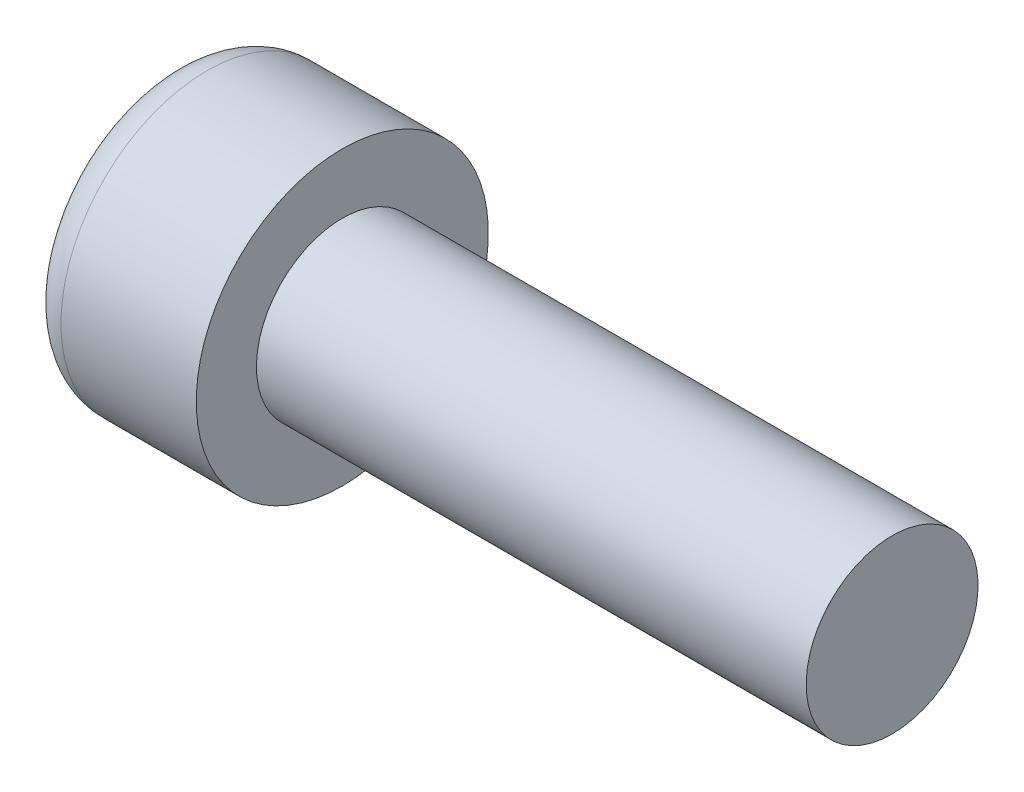
ISO-10303-21;
HEADER;
FILE_DESCRIPTION(('STEP AP214'),'2;1');
FILE_NAME('part.step','',(''),(''),'','','');
FILE_SCHEMA(('AUTOMOTIVE_DESIGN { 1 0 10303 214 1 1 1 1 }'));
ENDSEC;
DATA;
#1=APPLICATION_CONTEXT('core data for automotive mechanical design processes');
#2=APPLICATION_PROTOCOL_DEFINITION('international standard','automotive_design',2000,#1);
#3=PRODUCT_CONTEXT('',#1,'mechanical');
#4=PRODUCT('Part','Part','',(#3));
#5=PRODUCT_RELATED_PRODUCT_CATEGORY('part','',(#4));
#6=PRODUCT_DEFINITION_FORMATION('','',#4);
#7=PRODUCT_DEFINITION_CONTEXT('part definition',#1,'design');
#8=PRODUCT_DEFINITION('design','',#6,#7);
#9=PRODUCT_DEFINITION_SHAPE('','',#8);
#10=(LENGTH_UNIT() NAMED_UNIT(*) SI_UNIT(.MILLI.,.METRE.));
#11=(NAMED_UNIT(*) PLANE_ANGLE_UNIT() SI_UNIT($,.RADIAN.));
#12=(NAMED_UNIT(*) SI_UNIT($,.STERADIAN.) SOLID_ANGLE_UNIT());
#13=UNCERTAINTY_MEASURE_WITH_UNIT(LENGTH_MEASURE(1.E-05),#10,'distance_accuracy_value','');
#14=(GEOMETRIC_REPRESENTATION_CONTEXT(3) GLOBAL_UNCERTAINTY_ASSIGNED_CONTEXT((#13)) GLOBAL_UNIT_ASSIGNED_CONTEXT((#10,
#11,#12)) REPRESENTATION_CONTEXT('',''));
#15=CARTESIAN_POINT('',(0.,0.,0.));
#16=DIRECTION('',(0.,0.,1.));
#17=DIRECTION('',(1.,0.,0.));
#18=AXIS2_PLACEMENT_3D('',#15,#16,#17);
#19=CARTESIAN_POINT('',(0.,0.,0.));
#20=DIRECTION('',(1.,0.,0.));
#21=DIRECTION('',(0.,1.,0.));
#22=AXIS2_PLACEMENT_3D('',#19,#20,#21);
#23=PLANE('',#22);
#24=DIRECTION('',(0.,-0.5,-0.866025403784439));
#25=VECTOR('',#24,1.);
#26=CARTESIAN_POINT('',(0.,2.3094010767585,0.));
#27=LINE('',#26,#25);
#28=CARTESIAN_POINT('',(0.,2.3094010767585,0.));
#29=VERTEX_POINT('',#28);
#30=CARTESIAN_POINT('',(0.,1.15470053837925,-2.));
#31=VERTEX_POINT('',#30);
#32=EDGE_CURVE('E121',#29,#31,#27,.T.);
#33=ORIENTED_EDGE('',*,*,#32,.F.);
#34=DIRECTION('',(0.,0.5,-0.866025403784439));
#35=VECTOR('',#34,1.);
#36=CARTESIAN_POINT('',(0.,1.15470053837925,2.));
#37=LINE('',#36,#35);
#38=CARTESIAN_POINT('',(0.,1.15470053837925,2.));
#39=VERTEX_POINT('',#38);
#40=EDGE_CURVE('E47',#39,#29,#37,.T.);
#41=ORIENTED_EDGE('',*,*,#40,.F.);
#42=DIRECTION('',(0.,1.,0.));
#43=VECTOR('',#42,1.);
#44=CARTESIAN_POINT('',(0.,-1.15470053837925,2.));
#45=LINE('',#44,#43);
#46=CARTESIAN_POINT('',(0.,-1.15470053837925,2.));
#47=VERTEX_POINT('',#46);
#48=EDGE_CURVE('E130',#47,#39,#45,.T.);
#49=ORIENTED_EDGE('',*,*,#48,.F.);
#50=DIRECTION('',(0.,0.5,0.866025403784439));
#51=VECTOR('',#50,1.);
#52=CARTESIAN_POINT('',(0.,-2.3094010767585,0.));
#53=LINE('',#52,#51);
#54=CARTESIAN_POINT('',(0.,-2.3094010767585,0.));
#55=VERTEX_POINT('',#54);
#56=EDGE_CURVE('E128',#55,#47,#53,.T.);
#57=ORIENTED_EDGE('',*,*,#56,.F.);
#58=DIRECTION('',(0.,-0.5,0.866025403784439));
#59=VECTOR('',#58,1.);
#60=CARTESIAN_POINT('',(0.,-1.15470053837925,-2.));
#61=LINE('',#60,#59);
#62=CARTESIAN_POINT('',(0.,-1.15470053837925,-2.));
#63=VERTEX_POINT('',#62);
#64=EDGE_CURVE('E95',#63,#55,#61,.T.);
#65=ORIENTED_EDGE('',*,*,#64,.F.);
#66=DIRECTION('',(0.,-1.,0.));
#67=VECTOR('',#66,1.);
#68=CARTESIAN_POINT('',(0.,1.15470053837925,-2.));
#69=LINE('',#68,#67);
#70=EDGE_CURVE('E124',#31,#63,#69,.T.);
#71=ORIENTED_EDGE('',*,*,#70,.F.);
#72=EDGE_LOOP('',(#33,#41,#49,#57,#65,#71));
#73=FACE_BOUND('',#72,.T.);
#74=CARTESIAN_POINT('',(0.,0.,0.));
#75=DIRECTION('',(-1.,0.,0.));
#76=DIRECTION('',(0.,-1.,0.));
#77=AXIS2_PLACEMENT_3D('',#74,#75,#76);
#78=CIRCLE('',#77,3.1875);
#79=CARTESIAN_POINT('',(0.,-3.1875,0.));
#80=VERTEX_POINT('',#79);
#81=EDGE_CURVE('E11',#80,#80,#78,.T.);
#82=ORIENTED_EDGE('',*,*,#81,.T.);
#83=EDGE_LOOP('',(#82));
#84=FACE_BOUND('',#83,.T.);
#85=ADVANCED_FACE('F33',(#73,#84),#23,.F.);
#86=CARTESIAN_POINT('',(1.0625,0.,0.));
#87=DIRECTION('',(-1.,0.,0.));
#88=DIRECTION('',(0.,-1.,0.));
#89=AXIS2_PLACEMENT_3D('',#86,#87,#88);
#90=TOROIDAL_SURFACE('',#89,3.1875,1.0625);
#91=ORIENTED_EDGE('',*,*,#81,.F.);
#92=EDGE_LOOP('',(#91));
#93=FACE_BOUND('',#92,.T.);
#94=CARTESIAN_POINT('',(1.0625,0.,0.));
#95=DIRECTION('',(-1.,0.,0.));
#96=DIRECTION('',(0.,-1.,0.));
#97=AXIS2_PLACEMENT_3D('',#94,#95,#96);
#98=CIRCLE('',#97,4.25);
#99=CARTESIAN_POINT('',(1.0625,-4.25,0.));
#100=VERTEX_POINT('',#99);
#101=EDGE_CURVE('E40',#100,#100,#98,.T.);
#102=ORIENTED_EDGE('',*,*,#101,.T.);
#103=EDGE_LOOP('',(#102));
#104=FACE_BOUND('',#103,.T.);
#105=ADVANCED_FACE('F150',(#93,#104),#90,.T.);
#106=CARTESIAN_POINT('',(0.,0.,0.));
#107=DIRECTION('',(-1.,0.,0.));
#108=DIRECTION('',(0.,-1.,0.));
#109=AXIS2_PLACEMENT_3D('',#106,#107,#108);
#110=CYLINDRICAL_SURFACE('',#109,4.25);
#111=ORIENTED_EDGE('',*,*,#101,.F.);
#112=EDGE_LOOP('',(#111));
#113=FACE_BOUND('',#112,.T.);
#114=CARTESIAN_POINT('',(5.,0.,0.));
#115=DIRECTION('',(-1.,0.,0.));
#116=DIRECTION('',(0.,-1.,0.));
#117=AXIS2_PLACEMENT_3D('',#114,#115,#116);
#118=CIRCLE('',#117,4.25);
#119=CARTESIAN_POINT('',(5.,-4.25,0.));
#120=VERTEX_POINT('',#119);
#121=EDGE_CURVE('E145',#120,#120,#118,.T.);
#122=ORIENTED_EDGE('',*,*,#121,.T.);
#123=EDGE_LOOP('',(#122));
#124=FACE_BOUND('',#123,.T.);
#125=ADVANCED_FACE('F152',(#113,#124),#110,.T.);
#126=CARTESIAN_POINT('',(5.,4.25,0.));
#127=DIRECTION('',(-1.,0.,0.));
#128=DIRECTION('',(0.,-1.,0.));
#129=AXIS2_PLACEMENT_3D('',#126,#127,#128);
#130=PLANE('',#129);
#131=ORIENTED_EDGE('',*,*,#121,.F.);
#132=EDGE_LOOP('',(#131));
#133=FACE_BOUND('',#132,.T.);
#134=CARTESIAN_POINT('',(5.,0.,0.));
#135=DIRECTION('',(-1.,0.,0.));
#136=DIRECTION('',(0.,-1.,0.));
#137=AXIS2_PLACEMENT_3D('',#134,#135,#136);
#138=CIRCLE('',#137,2.5);
#139=CARTESIAN_POINT('',(5.,-2.5,0.));
#140=VERTEX_POINT('',#139);
#141=EDGE_CURVE('E142',#140,#140,#138,.T.);
#142=ORIENTED_EDGE('',*,*,#141,.T.);
#143=EDGE_LOOP('',(#142));
#144=FACE_BOUND('',#143,.T.);
#145=ADVANCED_FACE('F155',(#133,#144),#130,.F.);
#146=CARTESIAN_POINT('',(0.,0.,0.));
#147=DIRECTION('',(-1.,0.,0.));
#148=DIRECTION('',(0.,-1.,0.));
#149=AXIS2_PLACEMENT_3D('',#146,#147,#148);
#150=CYLINDRICAL_SURFACE('',#149,2.5);
#151=ORIENTED_EDGE('',*,*,#141,.F.);
#152=EDGE_LOOP('',(#151));
#153=FACE_BOUND('',#152,.T.);
#154=CARTESIAN_POINT('',(21.,0.,0.));
#155=DIRECTION('',(-1.,0.,0.));
#156=DIRECTION('',(0.,-1.,0.));
#157=AXIS2_PLACEMENT_3D('',#154,#155,#156);
#158=CIRCLE('',#157,2.5);
#159=CARTESIAN_POINT('',(21.,-2.49999999999999,0.));
#160=VERTEX_POINT('',#159);
#161=EDGE_CURVE('E134',#160,#160,#158,.T.);
#162=ORIENTED_EDGE('',*,*,#161,.T.);
#163=EDGE_LOOP('',(#162));
#164=FACE_BOUND('',#163,.T.);
#165=ADVANCED_FACE('F161',(#153,#164),#150,.T.);
#166=CARTESIAN_POINT('',(21.,2.5,0.));
#167=DIRECTION('',(-1.,0.,0.));
#168=DIRECTION('',(0.,-1.,0.));
#169=AXIS2_PLACEMENT_3D('',#166,#167,#168);
#170=PLANE('',#169);
#171=ORIENTED_EDGE('',*,*,#161,.F.);
#172=EDGE_LOOP('',(#171));
#173=FACE_BOUND('',#172,.T.);
#174=ADVANCED_FACE('F167',(#173),#170,.F.);
#175=CARTESIAN_POINT('',(2.5,1.15470053837925,2.));
#176=DIRECTION('',(0.,0.866025403784439,0.5));
#177=DIRECTION('',(0.,-0.5,0.866025403784439));
#178=AXIS2_PLACEMENT_3D('',#175,#176,#177);
#179=PLANE('',#178);
#180=ORIENTED_EDGE('',*,*,#40,.T.);
#181=DIRECTION('',(-1.,0.,0.));
#182=VECTOR('',#181,1.);
#183=CARTESIAN_POINT('',(2.5,2.3094010767585,0.));
#184=LINE('',#183,#182);
#185=CARTESIAN_POINT('',(2.5,2.3094010767585,0.));
#186=VERTEX_POINT('',#185);
#187=EDGE_CURVE('E77',#186,#29,#184,.T.);
#188=ORIENTED_EDGE('',*,*,#187,.F.);
#189=DIRECTION('',(0.,0.5,-0.866025403784439));
#190=VECTOR('',#189,1.);
#191=CARTESIAN_POINT('',(2.5,1.15470053837925,2.));
#192=LINE('',#191,#190);
#193=CARTESIAN_POINT('',(2.5,1.15470053837925,2.));
#194=VERTEX_POINT('',#193);
#195=EDGE_CURVE('E132',#194,#186,#192,.T.);
#196=ORIENTED_EDGE('',*,*,#195,.F.);
#197=DIRECTION('',(-1.,0.,0.));
#198=VECTOR('',#197,1.);
#199=CARTESIAN_POINT('',(2.5,1.15470053837925,2.));
#200=LINE('',#199,#198);
#201=EDGE_CURVE('E55',#194,#39,#200,.T.);
#202=ORIENTED_EDGE('',*,*,#201,.T.);
#203=EDGE_LOOP('',(#180,#188,#196,#202));
#204=FACE_BOUND('',#203,.T.);
#205=ADVANCED_FACE('F172',(#204),#179,.F.);
#206=CARTESIAN_POINT('',(2.5,-1.15470053837925,2.));
#207=DIRECTION('',(0.,0.,1.));
#208=DIRECTION('',(1.,0.,0.));
#209=AXIS2_PLACEMENT_3D('',#206,#207,#208);
#210=PLANE('',#209);
#211=ORIENTED_EDGE('',*,*,#48,.T.);
#212=ORIENTED_EDGE('',*,*,#201,.F.);
#213=DIRECTION('',(0.,1.,0.));
#214=VECTOR('',#213,1.);
#215=CARTESIAN_POINT('',(2.5,-1.15470053837925,2.));
#216=LINE('',#215,#214);
#217=CARTESIAN_POINT('',(2.5,-1.15470053837925,2.));
#218=VERTEX_POINT('',#217);
#219=EDGE_CURVE('E107',#218,#194,#216,.T.);
#220=ORIENTED_EDGE('',*,*,#219,.F.);
#221=DIRECTION('',(-1.,0.,0.));
#222=VECTOR('',#221,1.);
#223=CARTESIAN_POINT('',(2.5,-1.15470053837925,2.));
#224=LINE('',#223,#222);
#225=EDGE_CURVE('E99',#218,#47,#224,.T.);
#226=ORIENTED_EDGE('',*,*,#225,.T.);
#227=EDGE_LOOP('',(#211,#212,#220,#226));
#228=FACE_BOUND('',#227,.T.);
#229=ADVANCED_FACE('F177',(#228),#210,.F.);
#230=CARTESIAN_POINT('',(2.5,-2.3094010767585,0.));
#231=DIRECTION('',(0.,-0.866025403784439,0.5));
#232=DIRECTION('',(0.,-0.5,-0.866025403784439));
#233=AXIS2_PLACEMENT_3D('',#230,#231,#232);
#234=PLANE('',#233);
#235=ORIENTED_EDGE('',*,*,#56,.T.);
#236=ORIENTED_EDGE('',*,*,#225,.F.);
#237=DIRECTION('',(0.,0.5,0.866025403784439));
#238=VECTOR('',#237,1.);
#239=CARTESIAN_POINT('',(2.5,-2.3094010767585,0.));
#240=LINE('',#239,#238);
#241=CARTESIAN_POINT('',(2.5,-2.3094010767585,0.));
#242=VERTEX_POINT('',#241);
#243=EDGE_CURVE('E103',#242,#218,#240,.T.);
#244=ORIENTED_EDGE('',*,*,#243,.F.);
#245=DIRECTION('',(-1.,0.,0.));
#246=VECTOR('',#245,1.);
#247=CARTESIAN_POINT('',(2.5,-2.3094010767585,0.));
#248=LINE('',#247,#246);
#249=EDGE_CURVE('E88',#242,#55,#248,.T.);
#250=ORIENTED_EDGE('',*,*,#249,.T.);
#251=EDGE_LOOP('',(#235,#236,#244,#250));
#252=FACE_BOUND('',#251,.T.);
#253=ADVANCED_FACE('F104',(#252),#234,.F.);
#254=CARTESIAN_POINT('',(2.5,-1.15470053837925,-2.));
#255=DIRECTION('',(0.,-0.866025403784438,-0.5));
#256=DIRECTION('',(0.,0.5,-0.866025403784438));
#257=AXIS2_PLACEMENT_3D('',#254,#255,#256);
#258=PLANE('',#257);
#259=ORIENTED_EDGE('',*,*,#64,.T.);
#260=ORIENTED_EDGE('',*,*,#249,.F.);
#261=DIRECTION('',(0.,-0.5,0.866025403784439));
#262=VECTOR('',#261,1.);
#263=CARTESIAN_POINT('',(2.5,-1.15470053837925,-2.));
#264=LINE('',#263,#262);
#265=CARTESIAN_POINT('',(2.5,-1.15470053837925,-2.));
#266=VERTEX_POINT('',#265);
#267=EDGE_CURVE('E92',#266,#242,#264,.T.);
#268=ORIENTED_EDGE('',*,*,#267,.F.);
#269=DIRECTION('',(-1.,0.,0.));
#270=VECTOR('',#269,1.);
#271=CARTESIAN_POINT('',(2.5,-1.15470053837925,-2.));
#272=LINE('',#271,#270);
#273=EDGE_CURVE('E100',#266,#63,#272,.T.);
#274=ORIENTED_EDGE('',*,*,#273,.T.);
#275=EDGE_LOOP('',(#259,#260,#268,#274));
#276=FACE_BOUND('',#275,.T.);
#277=ADVANCED_FACE('F90',(#276),#258,.F.);
#278=CARTESIAN_POINT('',(2.5,1.15470053837925,-2.));
#279=DIRECTION('',(0.,0.,-1.));
#280=DIRECTION('',(-1.,0.,0.));
#281=AXIS2_PLACEMENT_3D('',#278,#279,#280);
#282=PLANE('',#281);
#283=ORIENTED_EDGE('',*,*,#70,.T.);
#284=ORIENTED_EDGE('',*,*,#273,.F.);
#285=DIRECTION('',(0.,-1.,0.));
#286=VECTOR('',#285,1.);
#287=CARTESIAN_POINT('',(2.5,1.15470053837925,-2.));
#288=LINE('',#287,#286);
#289=CARTESIAN_POINT('',(2.5,1.15470053837925,-2.));
#290=VERTEX_POINT('',#289);
#291=EDGE_CURVE('E113',#290,#266,#288,.T.);
#292=ORIENTED_EDGE('',*,*,#291,.F.);
#293=DIRECTION('',(-1.,0.,0.));
#294=VECTOR('',#293,1.);
#295=CARTESIAN_POINT('',(2.5,1.15470053837925,-2.));
#296=LINE('',#295,#294);
#297=EDGE_CURVE('E137',#290,#31,#296,.T.);
#298=ORIENTED_EDGE('',*,*,#297,.T.);
#299=EDGE_LOOP('',(#283,#284,#292,#298));
#300=FACE_BOUND('',#299,.T.);
#301=ADVANCED_FACE('F203',(#300),#282,.F.);
#302=CARTESIAN_POINT('',(2.5,2.3094010767585,0.));
#303=DIRECTION('',(0.,0.866025403784439,-0.5));
#304=DIRECTION('',(0.,0.5,0.866025403784439));
#305=AXIS2_PLACEMENT_3D('',#302,#303,#304);
#306=PLANE('',#305);
#307=ORIENTED_EDGE('',*,*,#32,.T.);
#308=ORIENTED_EDGE('',*,*,#297,.F.);
#309=DIRECTION('',(0.,-0.5,-0.866025403784439));
#310=VECTOR('',#309,1.);
#311=CARTESIAN_POINT('',(2.5,2.3094010767585,0.));
#312=LINE('',#311,#310);
#313=EDGE_CURVE('E115',#186,#290,#312,.T.);
#314=ORIENTED_EDGE('',*,*,#313,.F.);
#315=ORIENTED_EDGE('',*,*,#187,.T.);
#316=EDGE_LOOP('',(#307,#308,#314,#315));
#317=FACE_BOUND('',#316,.T.);
#318=ADVANCED_FACE('F191',(#317),#306,.F.);
#319=CARTESIAN_POINT('',(2.5,0.,0.));
#320=DIRECTION('',(-1.,0.,0.));
#321=DIRECTION('',(0.,-1.,0.));
#322=AXIS2_PLACEMENT_3D('',#319,#320,#321);
#323=PLANE('',#322);
#324=ORIENTED_EDGE('',*,*,#195,.T.);
#325=ORIENTED_EDGE('',*,*,#313,.T.);
#326=ORIENTED_EDGE('',*,*,#291,.T.);
#327=ORIENTED_EDGE('',*,*,#267,.T.);
#328=ORIENTED_EDGE('',*,*,#243,.T.);
#329=ORIENTED_EDGE('',*,*,#219,.T.);
#330=EDGE_LOOP('',(#324,#325,#326,#327,#328,#329));
#331=FACE_BOUND('',#330,.T.);
#332=ADVANCED_FACE('F110',(#331),#323,.T.);
#333=CLOSED_SHELL('',(#85,#105,#125,#145,#165,#174,#205,#229,#253,#277,#301,#318,#332));
#334=MANIFOLD_SOLID_BREP('B2',#333);
#335=ADVANCED_BREP_SHAPE_REPRESENTATION('',(#18,#334),#14);
#336=SHAPE_DEFINITION_REPRESENTATION(#9,#335);
ENDSEC;
END-ISO-10303-21;
